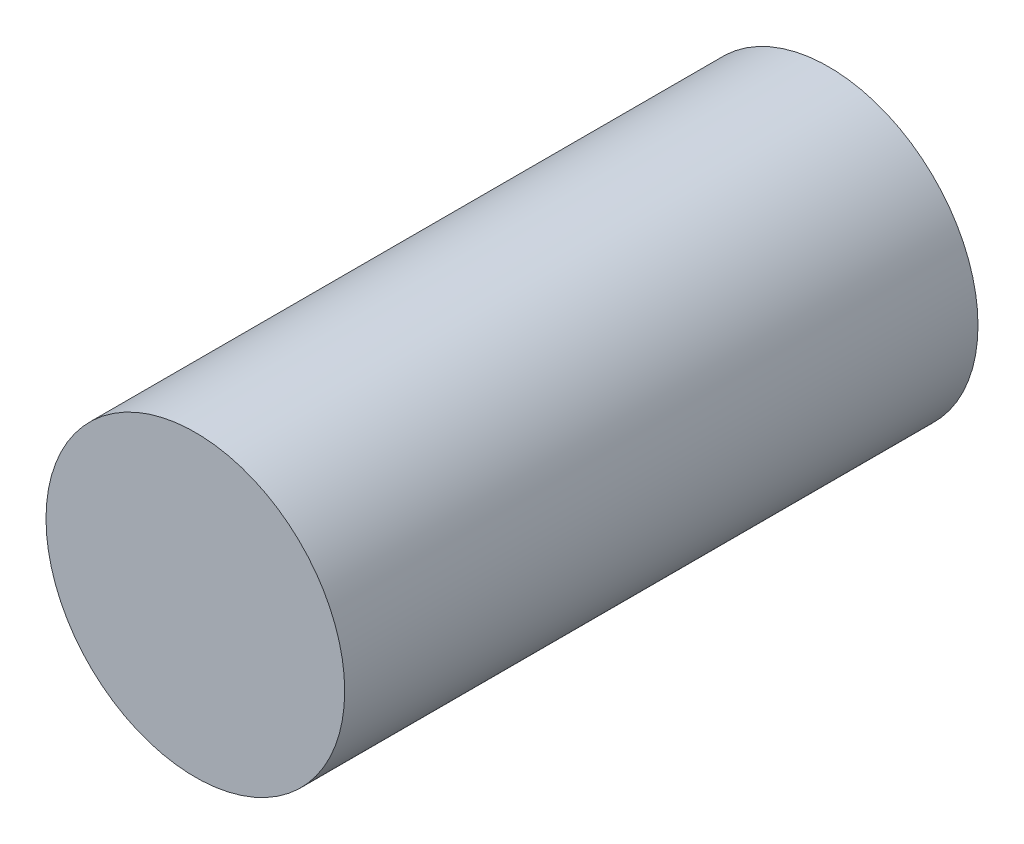
ISO-10303-21;
HEADER;
FILE_DESCRIPTION(('STEP AP214'),'2;1');
FILE_NAME('part.step','',(''),(''),'','','');
FILE_SCHEMA(('AUTOMOTIVE_DESIGN { 1 0 10303 214 1 1 1 1 }'));
ENDSEC;
DATA;
#1=APPLICATION_CONTEXT('core data for automotive mechanical design processes');
#2=APPLICATION_PROTOCOL_DEFINITION('international standard','automotive_design',2000,#1);
#3=PRODUCT_CONTEXT('',#1,'mechanical');
#4=PRODUCT('Part','Part','',(#3));
#5=PRODUCT_RELATED_PRODUCT_CATEGORY('part','',(#4));
#6=PRODUCT_DEFINITION_FORMATION('','',#4);
#7=PRODUCT_DEFINITION_CONTEXT('part definition',#1,'design');
#8=PRODUCT_DEFINITION('design','',#6,#7);
#9=PRODUCT_DEFINITION_SHAPE('','',#8);
#10=(LENGTH_UNIT() NAMED_UNIT(*) SI_UNIT(.MILLI.,.METRE.));
#11=(NAMED_UNIT(*) PLANE_ANGLE_UNIT() SI_UNIT($,.RADIAN.));
#12=(NAMED_UNIT(*) SI_UNIT($,.STERADIAN.) SOLID_ANGLE_UNIT());
#13=UNCERTAINTY_MEASURE_WITH_UNIT(LENGTH_MEASURE(1.E-05),#10,'distance_accuracy_value','');
#14=(GEOMETRIC_REPRESENTATION_CONTEXT(3) GLOBAL_UNCERTAINTY_ASSIGNED_CONTEXT((#13)) GLOBAL_UNIT_ASSIGNED_CONTEXT((#10,
#11,#12)) REPRESENTATION_CONTEXT('',''));
#15=CARTESIAN_POINT('',(0.,0.,0.));
#16=DIRECTION('',(0.,0.,1.));
#17=DIRECTION('',(1.,0.,0.));
#18=AXIS2_PLACEMENT_3D('',#15,#16,#17);
#19=CARTESIAN_POINT('',(0.,0.,-7.539999906));
#20=DIRECTION('',(0.,0.,1.));
#21=DIRECTION('',(-1.,0.,0.));
#22=AXIS2_PLACEMENT_3D('',#19,#20,#21);
#23=CYLINDRICAL_SURFACE('',#22,1.778);
#24=CARTESIAN_POINT('',(0.,0.,-7.539999906));
#25=DIRECTION('',(0.,0.,1.));
#26=DIRECTION('',(1.,0.,0.));
#27=AXIS2_PLACEMENT_3D('',#24,#25,#26);
#28=CIRCLE('',#27,1.778);
#29=CARTESIAN_POINT('',(1.778,0.,-7.539999906));
#30=VERTEX_POINT('',#29);
#31=EDGE_CURVE('E10',#30,#30,#28,.T.);
#32=ORIENTED_EDGE('',*,*,#31,.T.);
#33=EDGE_LOOP('',(#32));
#34=FACE_BOUND('',#33,.T.);
#35=CARTESIAN_POINT('',(0.,0.,0.));
#36=DIRECTION('',(0.,0.,1.));
#37=DIRECTION('',(1.,0.,0.));
#38=AXIS2_PLACEMENT_3D('',#35,#36,#37);
#39=CIRCLE('',#38,1.778);
#40=CARTESIAN_POINT('',(1.778,0.,0.));
#41=VERTEX_POINT('',#40);
#42=EDGE_CURVE('E44',#41,#41,#39,.T.);
#43=ORIENTED_EDGE('',*,*,#42,.F.);
#44=EDGE_LOOP('',(#43));
#45=FACE_BOUND('',#44,.T.);
#46=ADVANCED_FACE('F41',(#34,#45),#23,.T.);
#47=CARTESIAN_POINT('',(0.,0.,-7.539999906));
#48=DIRECTION('',(0.,0.,-1.));
#49=DIRECTION('',(1.,0.,0.));
#50=AXIS2_PLACEMENT_3D('',#47,#48,#49);
#51=PLANE('',#50);
#52=ORIENTED_EDGE('',*,*,#31,.F.);
#53=EDGE_LOOP('',(#52));
#54=FACE_BOUND('',#53,.T.);
#55=ADVANCED_FACE('F56',(#54),#51,.T.);
#56=CARTESIAN_POINT('',(0.,0.,0.));
#57=DIRECTION('',(0.,0.,-1.));
#58=DIRECTION('',(1.,0.,0.));
#59=AXIS2_PLACEMENT_3D('',#56,#57,#58);
#60=PLANE('',#59);
#61=ORIENTED_EDGE('',*,*,#42,.T.);
#62=EDGE_LOOP('',(#61));
#63=FACE_BOUND('',#62,.T.);
#64=ADVANCED_FACE('F53',(#63),#60,.F.);
#65=CLOSED_SHELL('',(#46,#55,#64));
#66=MANIFOLD_SOLID_BREP('B2',#65);
#67=ADVANCED_BREP_SHAPE_REPRESENTATION('',(#18,#66),#14);
#68=SHAPE_DEFINITION_REPRESENTATION(#9,#67);
ENDSEC;
END-ISO-10303-21;
